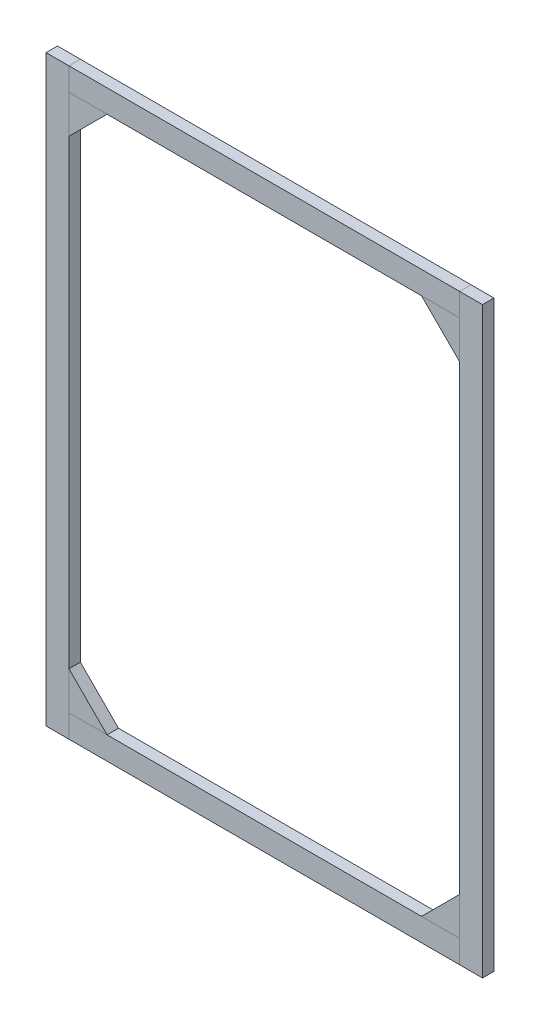
ISO-10303-21;
HEADER;
FILE_DESCRIPTION(('STEP AP214'),'2;1');
FILE_NAME('part.step','',(''),(''),'','','');
FILE_SCHEMA(('AUTOMOTIVE_DESIGN { 1 0 10303 214 1 1 1 1 }'));
ENDSEC;
DATA;
#1=APPLICATION_CONTEXT('core data for automotive mechanical design processes');
#2=APPLICATION_PROTOCOL_DEFINITION('international standard','automotive_design',2000,#1);
#3=PRODUCT_CONTEXT('',#1,'mechanical');
#4=PRODUCT('Part','Part','',(#3));
#5=PRODUCT_RELATED_PRODUCT_CATEGORY('part','',(#4));
#6=PRODUCT_DEFINITION_FORMATION('','',#4);
#7=PRODUCT_DEFINITION_CONTEXT('part definition',#1,'design');
#8=PRODUCT_DEFINITION('design','',#6,#7);
#9=PRODUCT_DEFINITION_SHAPE('','',#8);
#10=(LENGTH_UNIT() NAMED_UNIT(*) SI_UNIT(.MILLI.,.METRE.));
#11=(NAMED_UNIT(*) PLANE_ANGLE_UNIT() SI_UNIT($,.RADIAN.));
#12=(NAMED_UNIT(*) SI_UNIT($,.STERADIAN.) SOLID_ANGLE_UNIT());
#13=UNCERTAINTY_MEASURE_WITH_UNIT(LENGTH_MEASURE(1.E-05),#10,'distance_accuracy_value','');
#14=(GEOMETRIC_REPRESENTATION_CONTEXT(3) GLOBAL_UNCERTAINTY_ASSIGNED_CONTEXT((#13)) GLOBAL_UNIT_ASSIGNED_CONTEXT((#10,
#11,#12)) REPRESENTATION_CONTEXT('',''));
#15=CARTESIAN_POINT('',(0.,0.,0.));
#16=DIRECTION('',(0.,0.,1.));
#17=DIRECTION('',(1.,0.,0.));
#18=AXIS2_PLACEMENT_3D('',#15,#16,#17);
#19=CARTESIAN_POINT('',(412.5,-705.,-15.));
#20=DIRECTION('',(0.707106781186547,-0.707106781186547,0.));
#21=DIRECTION('',(0.707106781186548,0.707106781186548,0.));
#22=AXIS2_PLACEMENT_3D('',#19,#20,#21);
#23=PLANE('',#22);
#24=DIRECTION('',(0.707106781186547,0.707106781186547,0.));
#25=VECTOR('',#24,1.);
#26=CARTESIAN_POINT('',(412.5,-705.,15.));
#27=LINE('',#26,#25);
#28=CARTESIAN_POINT('',(412.5,-705.,15.));
#29=VERTEX_POINT('',#28);
#30=CARTESIAN_POINT('',(512.5,-605.,14.9999999999981));
#31=VERTEX_POINT('',#30);
#32=EDGE_CURVE('E124',#29,#31,#27,.T.);
#33=ORIENTED_EDGE('',*,*,#32,.T.);
#34=DIRECTION('',(0.,0.,1.));
#35=VECTOR('',#34,1.);
#36=CARTESIAN_POINT('',(512.5,-605.,-15.0000000000019));
#37=LINE('',#36,#35);
#38=CARTESIAN_POINT('',(512.5,-605.,-15.0000000000019));
#39=VERTEX_POINT('',#38);
#40=EDGE_CURVE('E13',#39,#31,#37,.T.);
#41=ORIENTED_EDGE('',*,*,#40,.F.);
#42=DIRECTION('',(0.707106781186547,0.707106781186547,0.));
#43=VECTOR('',#42,1.);
#44=CARTESIAN_POINT('',(412.5,-705.,-15.));
#45=LINE('',#44,#43);
#46=CARTESIAN_POINT('',(412.5,-705.,-15.));
#47=VERTEX_POINT('',#46);
#48=EDGE_CURVE('E117',#47,#39,#45,.T.);
#49=ORIENTED_EDGE('',*,*,#48,.F.);
#50=DIRECTION('',(0.,0.,1.));
#51=VECTOR('',#50,1.);
#52=CARTESIAN_POINT('',(412.5,-705.,-15.));
#53=LINE('',#52,#51);
#54=EDGE_CURVE('E125',#47,#29,#53,.T.);
#55=ORIENTED_EDGE('',*,*,#54,.T.);
#56=EDGE_LOOP('',(#33,#41,#49,#55));
#57=FACE_BOUND('',#56,.T.);
#58=ADVANCED_FACE('F74',(#57),#23,.F.);
#59=CARTESIAN_POINT('',(512.5,-705.,-15.));
#60=DIRECTION('',(-1.,0.,0.));
#61=DIRECTION('',(0.,0.,-1.));
#62=AXIS2_PLACEMENT_3D('',#59,#60,#61);
#63=PLANE('',#62);
#64=DIRECTION('',(0.,-1.,0.));
#65=VECTOR('',#64,1.);
#66=CARTESIAN_POINT('',(512.5,-705.,15.));
#67=LINE('',#66,#65);
#68=CARTESIAN_POINT('',(512.5,-705.,15.));
#69=VERTEX_POINT('',#68);
#70=EDGE_CURVE('E127',#31,#69,#67,.T.);
#71=ORIENTED_EDGE('',*,*,#70,.T.);
#72=DIRECTION('',(0.,0.,1.));
#73=VECTOR('',#72,1.);
#74=CARTESIAN_POINT('',(512.5,-705.,-15.));
#75=LINE('',#74,#73);
#76=CARTESIAN_POINT('',(512.5,-705.,-15.));
#77=VERTEX_POINT('',#76);
#78=EDGE_CURVE('E83',#77,#69,#75,.T.);
#79=ORIENTED_EDGE('',*,*,#78,.F.);
#80=DIRECTION('',(0.,-1.,0.));
#81=VECTOR('',#80,1.);
#82=CARTESIAN_POINT('',(512.5,-705.,-15.));
#83=LINE('',#82,#81);
#84=EDGE_CURVE('E111',#39,#77,#83,.T.);
#85=ORIENTED_EDGE('',*,*,#84,.F.);
#86=ORIENTED_EDGE('',*,*,#40,.T.);
#87=EDGE_LOOP('',(#71,#79,#85,#86));
#88=FACE_BOUND('',#87,.T.);
#89=ADVANCED_FACE('F113',(#88),#63,.F.);
#90=CARTESIAN_POINT('',(512.5,-705.,-15.));
#91=DIRECTION('',(0.,1.,0.));
#92=DIRECTION('',(0.,0.,-1.));
#93=AXIS2_PLACEMENT_3D('',#90,#91,#92);
#94=PLANE('',#93);
#95=DIRECTION('',(-1.,0.,0.));
#96=VECTOR('',#95,1.);
#97=CARTESIAN_POINT('',(512.5,-705.,15.));
#98=LINE('',#97,#96);
#99=EDGE_CURVE('E104',#69,#29,#98,.T.);
#100=ORIENTED_EDGE('',*,*,#99,.T.);
#101=ORIENTED_EDGE('',*,*,#54,.F.);
#102=DIRECTION('',(-1.,0.,0.));
#103=VECTOR('',#102,1.);
#104=CARTESIAN_POINT('',(512.5,-705.,-15.));
#105=LINE('',#104,#103);
#106=EDGE_CURVE('E91',#77,#47,#105,.T.);
#107=ORIENTED_EDGE('',*,*,#106,.F.);
#108=ORIENTED_EDGE('',*,*,#78,.T.);
#109=EDGE_LOOP('',(#100,#101,#107,#108));
#110=FACE_BOUND('',#109,.T.);
#111=ADVANCED_FACE('F139',(#110),#94,.F.);
#112=CARTESIAN_POINT('',(0.,-2.77469019982732E-13,-15.000000000013));
#113=DIRECTION('',(0.,0.,1.));
#114=DIRECTION('',(0.,1.,0.));
#115=AXIS2_PLACEMENT_3D('',#112,#113,#114);
#116=PLANE('',#115);
#117=ORIENTED_EDGE('',*,*,#48,.T.);
#118=ORIENTED_EDGE('',*,*,#84,.T.);
#119=ORIENTED_EDGE('',*,*,#106,.T.);
#120=EDGE_LOOP('',(#117,#118,#119));
#121=FACE_BOUND('',#120,.T.);
#122=ADVANCED_FACE('F120',(#121),#116,.F.);
#123=CARTESIAN_POINT('',(0.,2.77642492329846E-13,14.999999999987));
#124=DIRECTION('',(0.,0.,1.));
#125=DIRECTION('',(0.,1.,0.));
#126=AXIS2_PLACEMENT_3D('',#123,#124,#125);
#127=PLANE('',#126);
#128=ORIENTED_EDGE('',*,*,#32,.F.);
#129=ORIENTED_EDGE('',*,*,#99,.F.);
#130=ORIENTED_EDGE('',*,*,#70,.F.);
#131=EDGE_LOOP('',(#128,#129,#130));
#132=FACE_BOUND('',#131,.T.);
#133=ADVANCED_FACE('F140',(#132),#127,.T.);
#134=CLOSED_SHELL('',(#58,#89,#111,#122,#133));
#135=MANIFOLD_SOLID_BREP('B2',#134);
#136=CARTESIAN_POINT('',(-412.5,-705.,-15.));
#137=DIRECTION('',(-0.707106781186547,-0.707106781186547,0.));
#138=DIRECTION('',(-0.707106781186548,0.707106781186548,0.));
#139=AXIS2_PLACEMENT_3D('',#136,#137,#138);
#140=PLANE('',#139);
#141=DIRECTION('',(-0.707106781186547,0.707106781186547,0.));
#142=VECTOR('',#141,1.);
#143=CARTESIAN_POINT('',(-412.5,-705.,15.));
#144=LINE('',#143,#142);
#145=CARTESIAN_POINT('',(-412.5,-705.,15.));
#146=VERTEX_POINT('',#145);
#147=CARTESIAN_POINT('',(-512.5,-605.,14.9999999999981));
#148=VERTEX_POINT('',#147);
#149=EDGE_CURVE('E267',#146,#148,#144,.T.);
#150=ORIENTED_EDGE('',*,*,#149,.F.);
#151=DIRECTION('',(0.,0.,1.));
#152=VECTOR('',#151,1.);
#153=CARTESIAN_POINT('',(-412.5,-705.,-15.));
#154=LINE('',#153,#152);
#155=CARTESIAN_POINT('',(-412.5,-705.,-15.));
#156=VERTEX_POINT('',#155);
#157=EDGE_CURVE('E258',#156,#146,#154,.T.);
#158=ORIENTED_EDGE('',*,*,#157,.F.);
#159=DIRECTION('',(-0.707106781186547,0.707106781186547,0.));
#160=VECTOR('',#159,1.);
#161=CARTESIAN_POINT('',(-412.5,-705.,-15.));
#162=LINE('',#161,#160);
#163=CARTESIAN_POINT('',(-512.5,-605.,-15.0000000000019));
#164=VERTEX_POINT('',#163);
#165=EDGE_CURVE('E249',#156,#164,#162,.T.);
#166=ORIENTED_EDGE('',*,*,#165,.T.);
#167=DIRECTION('',(0.,0.,1.));
#168=VECTOR('',#167,1.);
#169=CARTESIAN_POINT('',(-512.5,-605.,-15.0000000000019));
#170=LINE('',#169,#168);
#171=EDGE_CURVE('E72',#164,#148,#170,.T.);
#172=ORIENTED_EDGE('',*,*,#171,.T.);
#173=EDGE_LOOP('',(#150,#158,#166,#172));
#174=FACE_BOUND('',#173,.T.);
#175=ADVANCED_FACE('F209',(#174),#140,.F.);
#176=CARTESIAN_POINT('',(-512.5,-705.,-15.));
#177=DIRECTION('',(1.,0.,0.));
#178=DIRECTION('',(0.,0.,-1.));
#179=AXIS2_PLACEMENT_3D('',#176,#177,#178);
#180=PLANE('',#179);
#181=DIRECTION('',(0.,-1.,0.));
#182=VECTOR('',#181,1.);
#183=CARTESIAN_POINT('',(-512.5,-705.,15.));
#184=LINE('',#183,#182);
#185=CARTESIAN_POINT('',(-512.5,-705.,15.));
#186=VERTEX_POINT('',#185);
#187=EDGE_CURVE('E255',#148,#186,#184,.T.);
#188=ORIENTED_EDGE('',*,*,#187,.F.);
#189=ORIENTED_EDGE('',*,*,#171,.F.);
#190=DIRECTION('',(0.,-1.,0.));
#191=VECTOR('',#190,1.);
#192=CARTESIAN_POINT('',(-512.5,-705.,-15.));
#193=LINE('',#192,#191);
#194=CARTESIAN_POINT('',(-512.5,-705.,-15.));
#195=VERTEX_POINT('',#194);
#196=EDGE_CURVE('E245',#164,#195,#193,.T.);
#197=ORIENTED_EDGE('',*,*,#196,.T.);
#198=DIRECTION('',(0.,0.,1.));
#199=VECTOR('',#198,1.);
#200=CARTESIAN_POINT('',(-512.5,-705.,-15.));
#201=LINE('',#200,#199);
#202=EDGE_CURVE('E218',#195,#186,#201,.T.);
#203=ORIENTED_EDGE('',*,*,#202,.T.);
#204=EDGE_LOOP('',(#188,#189,#197,#203));
#205=FACE_BOUND('',#204,.T.);
#206=ADVANCED_FACE('F254',(#205),#180,.F.);
#207=CARTESIAN_POINT('',(-512.5,-705.,-15.));
#208=DIRECTION('',(0.,1.,0.));
#209=DIRECTION('',(0.,0.,-1.));
#210=AXIS2_PLACEMENT_3D('',#207,#208,#209);
#211=PLANE('',#210);
#212=DIRECTION('',(1.,0.,0.));
#213=VECTOR('',#212,1.);
#214=CARTESIAN_POINT('',(-512.5,-705.,15.));
#215=LINE('',#214,#213);
#216=EDGE_CURVE('E237',#186,#146,#215,.T.);
#217=ORIENTED_EDGE('',*,*,#216,.F.);
#218=ORIENTED_EDGE('',*,*,#202,.F.);
#219=DIRECTION('',(1.,0.,0.));
#220=VECTOR('',#219,1.);
#221=CARTESIAN_POINT('',(-512.5,-705.,-15.));
#222=LINE('',#221,#220);
#223=EDGE_CURVE('E226',#195,#156,#222,.T.);
#224=ORIENTED_EDGE('',*,*,#223,.T.);
#225=ORIENTED_EDGE('',*,*,#157,.T.);
#226=EDGE_LOOP('',(#217,#218,#224,#225));
#227=FACE_BOUND('',#226,.T.);
#228=ADVANCED_FACE('F281',(#227),#211,.F.);
#229=CARTESIAN_POINT('',(0.,-2.77469019982732E-13,-15.000000000013));
#230=DIRECTION('',(0.,0.,1.));
#231=DIRECTION('',(0.,1.,0.));
#232=AXIS2_PLACEMENT_3D('',#229,#230,#231);
#233=PLANE('',#232);
#234=ORIENTED_EDGE('',*,*,#165,.F.);
#235=ORIENTED_EDGE('',*,*,#223,.F.);
#236=ORIENTED_EDGE('',*,*,#196,.F.);
#237=EDGE_LOOP('',(#234,#235,#236));
#238=FACE_BOUND('',#237,.T.);
#239=ADVANCED_FACE('F247',(#238),#233,.F.);
#240=CARTESIAN_POINT('',(0.,2.77642492329846E-13,14.999999999987));
#241=DIRECTION('',(0.,0.,1.));
#242=DIRECTION('',(0.,1.,0.));
#243=AXIS2_PLACEMENT_3D('',#240,#241,#242);
#244=PLANE('',#243);
#245=ORIENTED_EDGE('',*,*,#149,.T.);
#246=ORIENTED_EDGE('',*,*,#187,.T.);
#247=ORIENTED_EDGE('',*,*,#216,.T.);
#248=EDGE_LOOP('',(#245,#246,#247));
#249=FACE_BOUND('',#248,.T.);
#250=ADVANCED_FACE('F275',(#249),#244,.T.);
#251=CLOSED_SHELL('',(#175,#206,#228,#239,#250));
#252=MANIFOLD_SOLID_BREP('B7',#251);
#253=CARTESIAN_POINT('',(412.5,705.,-15.));
#254=DIRECTION('',(0.707106781186547,0.707106781186547,0.));
#255=DIRECTION('',(0.707106781186548,-0.707106781186548,0.));
#256=AXIS2_PLACEMENT_3D('',#253,#254,#255);
#257=PLANE('',#256);
#258=DIRECTION('',(0.707106781186547,-0.707106781186547,0.));
#259=VECTOR('',#258,1.);
#260=CARTESIAN_POINT('',(412.5,705.,15.));
#261=LINE('',#260,#259);
#262=CARTESIAN_POINT('',(412.5,705.,15.));
#263=VERTEX_POINT('',#262);
#264=CARTESIAN_POINT('',(512.5,605.,14.9999999999981));
#265=VERTEX_POINT('',#264);
#266=EDGE_CURVE('E402',#263,#265,#261,.T.);
#267=ORIENTED_EDGE('',*,*,#266,.F.);
#268=DIRECTION('',(0.,0.,1.));
#269=VECTOR('',#268,1.);
#270=CARTESIAN_POINT('',(412.5,705.,-15.));
#271=LINE('',#270,#269);
#272=CARTESIAN_POINT('',(412.5,705.,-15.));
#273=VERTEX_POINT('',#272);
#274=EDGE_CURVE('E393',#273,#263,#271,.T.);
#275=ORIENTED_EDGE('',*,*,#274,.F.);
#276=DIRECTION('',(0.707106781186547,-0.707106781186547,0.));
#277=VECTOR('',#276,1.);
#278=CARTESIAN_POINT('',(412.5,705.,-15.));
#279=LINE('',#278,#277);
#280=CARTESIAN_POINT('',(512.5,605.,-15.0000000000019));
#281=VERTEX_POINT('',#280);
#282=EDGE_CURVE('E384',#273,#281,#279,.T.);
#283=ORIENTED_EDGE('',*,*,#282,.T.);
#284=DIRECTION('',(0.,0.,1.));
#285=VECTOR('',#284,1.);
#286=CARTESIAN_POINT('',(512.5,605.,-15.0000000000019));
#287=LINE('',#286,#285);
#288=EDGE_CURVE('E207',#281,#265,#287,.T.);
#289=ORIENTED_EDGE('',*,*,#288,.T.);
#290=EDGE_LOOP('',(#267,#275,#283,#289));
#291=FACE_BOUND('',#290,.T.);
#292=ADVANCED_FACE('F344',(#291),#257,.F.);
#293=CARTESIAN_POINT('',(512.5,705.,-15.));
#294=DIRECTION('',(-1.,0.,0.));
#295=DIRECTION('',(0.,0.,-1.));
#296=AXIS2_PLACEMENT_3D('',#293,#294,#295);
#297=PLANE('',#296);
#298=DIRECTION('',(0.,1.,0.));
#299=VECTOR('',#298,1.);
#300=CARTESIAN_POINT('',(512.5,705.,15.));
#301=LINE('',#300,#299);
#302=CARTESIAN_POINT('',(512.5,705.,15.));
#303=VERTEX_POINT('',#302);
#304=EDGE_CURVE('E390',#265,#303,#301,.T.);
#305=ORIENTED_EDGE('',*,*,#304,.F.);
#306=ORIENTED_EDGE('',*,*,#288,.F.);
#307=DIRECTION('',(0.,1.,0.));
#308=VECTOR('',#307,1.);
#309=CARTESIAN_POINT('',(512.5,705.,-15.));
#310=LINE('',#309,#308);
#311=CARTESIAN_POINT('',(512.5,705.,-15.));
#312=VERTEX_POINT('',#311);
#313=EDGE_CURVE('E380',#281,#312,#310,.T.);
#314=ORIENTED_EDGE('',*,*,#313,.T.);
#315=DIRECTION('',(0.,0.,1.));
#316=VECTOR('',#315,1.);
#317=CARTESIAN_POINT('',(512.5,705.,-15.));
#318=LINE('',#317,#316);
#319=EDGE_CURVE('E353',#312,#303,#318,.T.);
#320=ORIENTED_EDGE('',*,*,#319,.T.);
#321=EDGE_LOOP('',(#305,#306,#314,#320));
#322=FACE_BOUND('',#321,.T.);
#323=ADVANCED_FACE('F389',(#322),#297,.F.);
#324=CARTESIAN_POINT('',(512.5,705.,-15.));
#325=DIRECTION('',(0.,-1.,0.));
#326=DIRECTION('',(0.,0.,-1.));
#327=AXIS2_PLACEMENT_3D('',#324,#325,#326);
#328=PLANE('',#327);
#329=DIRECTION('',(-1.,0.,0.));
#330=VECTOR('',#329,1.);
#331=CARTESIAN_POINT('',(512.5,705.,15.));
#332=LINE('',#331,#330);
#333=EDGE_CURVE('E372',#303,#263,#332,.T.);
#334=ORIENTED_EDGE('',*,*,#333,.F.);
#335=ORIENTED_EDGE('',*,*,#319,.F.);
#336=DIRECTION('',(-1.,0.,0.));
#337=VECTOR('',#336,1.);
#338=CARTESIAN_POINT('',(512.5,705.,-15.));
#339=LINE('',#338,#337);
#340=EDGE_CURVE('E361',#312,#273,#339,.T.);
#341=ORIENTED_EDGE('',*,*,#340,.T.);
#342=ORIENTED_EDGE('',*,*,#274,.T.);
#343=EDGE_LOOP('',(#334,#335,#341,#342));
#344=FACE_BOUND('',#343,.T.);
#345=ADVANCED_FACE('F416',(#344),#328,.F.);
#346=CARTESIAN_POINT('',(0.,2.77469019982732E-13,-15.000000000013));
#347=DIRECTION('',(0.,0.,1.));
#348=DIRECTION('',(0.,-1.,0.));
#349=AXIS2_PLACEMENT_3D('',#346,#347,#348);
#350=PLANE('',#349);
#351=ORIENTED_EDGE('',*,*,#282,.F.);
#352=ORIENTED_EDGE('',*,*,#340,.F.);
#353=ORIENTED_EDGE('',*,*,#313,.F.);
#354=EDGE_LOOP('',(#351,#352,#353));
#355=FACE_BOUND('',#354,.T.);
#356=ADVANCED_FACE('F382',(#355),#350,.F.);
#357=CARTESIAN_POINT('',(0.,-2.77642492329846E-13,14.999999999987));
#358=DIRECTION('',(0.,0.,1.));
#359=DIRECTION('',(0.,-1.,0.));
#360=AXIS2_PLACEMENT_3D('',#357,#358,#359);
#361=PLANE('',#360);
#362=ORIENTED_EDGE('',*,*,#266,.T.);
#363=ORIENTED_EDGE('',*,*,#304,.T.);
#364=ORIENTED_EDGE('',*,*,#333,.T.);
#365=EDGE_LOOP('',(#362,#363,#364));
#366=FACE_BOUND('',#365,.T.);
#367=ADVANCED_FACE('F410',(#366),#361,.T.);
#368=CLOSED_SHELL('',(#292,#323,#345,#356,#367));
#369=MANIFOLD_SOLID_BREP('B66',#368);
#370=CARTESIAN_POINT('',(-412.5,705.,-15.));
#371=DIRECTION('',(-0.707106781186547,0.707106781186547,0.));
#372=DIRECTION('',(-0.707106781186548,-0.707106781186548,0.));
#373=AXIS2_PLACEMENT_3D('',#370,#371,#372);
#374=PLANE('',#373);
#375=DIRECTION('',(-0.707106781186547,-0.707106781186547,0.));
#376=VECTOR('',#375,1.);
#377=CARTESIAN_POINT('',(-412.5,705.,15.));
#378=LINE('',#377,#376);
#379=CARTESIAN_POINT('',(-412.5,705.,15.));
#380=VERTEX_POINT('',#379);
#381=CARTESIAN_POINT('',(-512.5,605.,14.9999999999981));
#382=VERTEX_POINT('',#381);
#383=EDGE_CURVE('E529',#380,#382,#378,.T.);
#384=ORIENTED_EDGE('',*,*,#383,.T.);
#385=DIRECTION('',(0.,0.,1.));
#386=VECTOR('',#385,1.);
#387=CARTESIAN_POINT('',(-512.5,605.,-15.0000000000019));
#388=LINE('',#387,#386);
#389=CARTESIAN_POINT('',(-512.5,605.,-15.0000000000019));
#390=VERTEX_POINT('',#389);
#391=EDGE_CURVE('E342',#390,#382,#388,.T.);
#392=ORIENTED_EDGE('',*,*,#391,.F.);
#393=DIRECTION('',(-0.707106781186547,-0.707106781186547,0.));
#394=VECTOR('',#393,1.);
#395=CARTESIAN_POINT('',(-412.5,705.,-15.));
#396=LINE('',#395,#394);
#397=CARTESIAN_POINT('',(-412.5,705.,-15.));
#398=VERTEX_POINT('',#397);
#399=EDGE_CURVE('E521',#398,#390,#396,.T.);
#400=ORIENTED_EDGE('',*,*,#399,.F.);
#401=DIRECTION('',(0.,0.,1.));
#402=VECTOR('',#401,1.);
#403=CARTESIAN_POINT('',(-412.5,705.,-15.));
#404=LINE('',#403,#402);
#405=EDGE_CURVE('E530',#398,#380,#404,.T.);
#406=ORIENTED_EDGE('',*,*,#405,.T.);
#407=EDGE_LOOP('',(#384,#392,#400,#406));
#408=FACE_BOUND('',#407,.T.);
#409=ADVANCED_FACE('F479',(#408),#374,.F.);
#410=CARTESIAN_POINT('',(-512.5,705.,-15.));
#411=DIRECTION('',(1.,0.,0.));
#412=DIRECTION('',(0.,0.,-1.));
#413=AXIS2_PLACEMENT_3D('',#410,#411,#412);
#414=PLANE('',#413);
#415=DIRECTION('',(0.,1.,0.));
#416=VECTOR('',#415,1.);
#417=CARTESIAN_POINT('',(-512.5,705.,15.));
#418=LINE('',#417,#416);
#419=CARTESIAN_POINT('',(-512.5,705.,15.));
#420=VERTEX_POINT('',#419);
#421=EDGE_CURVE('E508',#382,#420,#418,.T.);
#422=ORIENTED_EDGE('',*,*,#421,.T.);
#423=DIRECTION('',(0.,0.,1.));
#424=VECTOR('',#423,1.);
#425=CARTESIAN_POINT('',(-512.5,705.,-15.));
#426=LINE('',#425,#424);
#427=CARTESIAN_POINT('',(-512.5,705.,-15.));
#428=VERTEX_POINT('',#427);
#429=EDGE_CURVE('E488',#428,#420,#426,.T.);
#430=ORIENTED_EDGE('',*,*,#429,.F.);
#431=DIRECTION('',(0.,1.,0.));
#432=VECTOR('',#431,1.);
#433=CARTESIAN_POINT('',(-512.5,705.,-15.));
#434=LINE('',#433,#432);
#435=EDGE_CURVE('E516',#390,#428,#434,.T.);
#436=ORIENTED_EDGE('',*,*,#435,.F.);
#437=ORIENTED_EDGE('',*,*,#391,.T.);
#438=EDGE_LOOP('',(#422,#430,#436,#437));
#439=FACE_BOUND('',#438,.T.);
#440=ADVANCED_FACE('F517',(#439),#414,.F.);
#441=CARTESIAN_POINT('',(-512.5,705.,-15.));
#442=DIRECTION('',(0.,-1.,0.));
#443=DIRECTION('',(0.,0.,-1.));
#444=AXIS2_PLACEMENT_3D('',#441,#442,#443);
#445=PLANE('',#444);
#446=DIRECTION('',(1.,0.,0.));
#447=VECTOR('',#446,1.);
#448=CARTESIAN_POINT('',(-512.5,705.,15.));
#449=LINE('',#448,#447);
#450=EDGE_CURVE('E513',#420,#380,#449,.T.);
#451=ORIENTED_EDGE('',*,*,#450,.T.);
#452=ORIENTED_EDGE('',*,*,#405,.F.);
#453=DIRECTION('',(1.,0.,0.));
#454=VECTOR('',#453,1.);
#455=CARTESIAN_POINT('',(-512.5,705.,-15.));
#456=LINE('',#455,#454);
#457=EDGE_CURVE('E496',#428,#398,#456,.T.);
#458=ORIENTED_EDGE('',*,*,#457,.F.);
#459=ORIENTED_EDGE('',*,*,#429,.T.);
#460=EDGE_LOOP('',(#451,#452,#458,#459));
#461=FACE_BOUND('',#460,.T.);
#462=ADVANCED_FACE('F544',(#461),#445,.F.);
#463=CARTESIAN_POINT('',(0.,2.77469019982732E-13,-15.000000000013));
#464=DIRECTION('',(0.,0.,1.));
#465=DIRECTION('',(0.,-1.,0.));
#466=AXIS2_PLACEMENT_3D('',#463,#464,#465);
#467=PLANE('',#466);
#468=ORIENTED_EDGE('',*,*,#399,.T.);
#469=ORIENTED_EDGE('',*,*,#435,.T.);
#470=ORIENTED_EDGE('',*,*,#457,.T.);
#471=EDGE_LOOP('',(#468,#469,#470));
#472=FACE_BOUND('',#471,.T.);
#473=ADVANCED_FACE('F524',(#472),#467,.F.);
#474=CARTESIAN_POINT('',(0.,-2.77642492329846E-13,14.999999999987));
#475=DIRECTION('',(0.,0.,1.));
#476=DIRECTION('',(0.,-1.,0.));
#477=AXIS2_PLACEMENT_3D('',#474,#475,#476);
#478=PLANE('',#477);
#479=ORIENTED_EDGE('',*,*,#383,.F.);
#480=ORIENTED_EDGE('',*,*,#450,.F.);
#481=ORIENTED_EDGE('',*,*,#421,.F.);
#482=EDGE_LOOP('',(#479,#480,#481));
#483=FACE_BOUND('',#482,.T.);
#484=ADVANCED_FACE('F545',(#483),#478,.T.);
#485=CLOSED_SHELL('',(#409,#440,#462,#473,#484));
#486=MANIFOLD_SOLID_BREP('B201',#485);
#487=CARTESIAN_POINT('',(512.5,-735.,-15.));
#488=DIRECTION('',(1.,0.,0.));
#489=DIRECTION('',(0.,0.,-1.));
#490=AXIS2_PLACEMENT_3D('',#487,#488,#489);
#491=PLANE('',#490);
#492=DIRECTION('',(0.,0.,1.));
#493=VECTOR('',#492,1.);
#494=CARTESIAN_POINT('',(512.5,765.,15.));
#495=LINE('',#494,#493);
#496=CARTESIAN_POINT('',(512.5,765.000000000001,-15.));
#497=VERTEX_POINT('',#496);
#498=CARTESIAN_POINT('',(512.5,765.000000000001,15.));
#499=VERTEX_POINT('',#498);
#500=EDGE_CURVE('E670',#497,#499,#495,.T.);
#501=ORIENTED_EDGE('',*,*,#500,.T.);
#502=DIRECTION('',(0.,1.,0.));
#503=VECTOR('',#502,1.);
#504=CARTESIAN_POINT('',(512.5,-735.,15.));
#505=LINE('',#504,#503);
#506=CARTESIAN_POINT('',(512.5,705.,15.));
#507=VERTEX_POINT('',#506);
#508=EDGE_CURVE('E694',#507,#499,#505,.T.);
#509=ORIENTED_EDGE('',*,*,#508,.F.);
#510=DIRECTION('',(0.,0.,-1.));
#511=VECTOR('',#510,1.);
#512=CARTESIAN_POINT('',(512.5,705.,-15.));
#513=LINE('',#512,#511);
#514=CARTESIAN_POINT('',(512.5,705.,-15.));
#515=VERTEX_POINT('',#514);
#516=EDGE_CURVE('E637',#507,#515,#513,.T.);
#517=ORIENTED_EDGE('',*,*,#516,.T.);
#518=DIRECTION('',(0.,1.,0.));
#519=VECTOR('',#518,1.);
#520=CARTESIAN_POINT('',(512.5,705.,-15.));
#521=LINE('',#520,#519);
#522=EDGE_CURVE('E623',#515,#497,#521,.T.);
#523=ORIENTED_EDGE('',*,*,#522,.T.);
#524=EDGE_LOOP('',(#501,#509,#517,#523));
#525=FACE_BOUND('',#524,.T.);
#526=ADVANCED_FACE('F614',(#525),#491,.T.);
#527=CARTESIAN_POINT('',(542.5,765.,15.));
#528=DIRECTION('',(0.,-1.,0.));
#529=DIRECTION('',(1.,0.,0.));
#530=AXIS2_PLACEMENT_3D('',#527,#528,#529);
#531=PLANE('',#530);
#532=DIRECTION('',(0.,0.,-1.));
#533=VECTOR('',#532,1.);
#534=CARTESIAN_POINT('',(-512.5,765.,15.));
#535=LINE('',#534,#533);
#536=CARTESIAN_POINT('',(-512.5,765.,15.));
#537=VERTEX_POINT('',#536);
#538=CARTESIAN_POINT('',(-512.5,765.,-15.));
#539=VERTEX_POINT('',#538);
#540=EDGE_CURVE('E477',#537,#539,#535,.T.);
#541=ORIENTED_EDGE('',*,*,#540,.F.);
#542=DIRECTION('',(-1.,0.,0.));
#543=VECTOR('',#542,1.);
#544=CARTESIAN_POINT('',(542.5,765.,15.));
#545=LINE('',#544,#543);
#546=EDGE_CURVE('E684',#499,#537,#545,.T.);
#547=ORIENTED_EDGE('',*,*,#546,.F.);
#548=ORIENTED_EDGE('',*,*,#500,.F.);
#549=DIRECTION('',(-1.,0.,0.));
#550=VECTOR('',#549,1.);
#551=CARTESIAN_POINT('',(542.5,765.,-15.));
#552=LINE('',#551,#550);
#553=EDGE_CURVE('E664',#497,#539,#552,.T.);
#554=ORIENTED_EDGE('',*,*,#553,.T.);
#555=EDGE_LOOP('',(#541,#547,#548,#554));
#556=FACE_BOUND('',#555,.T.);
#557=ADVANCED_FACE('F616',(#556),#531,.F.);
#558=CARTESIAN_POINT('',(542.5,765.,15.));
#559=DIRECTION('',(0.,0.,-1.));
#560=DIRECTION('',(-1.,0.,0.));
#561=AXIS2_PLACEMENT_3D('',#558,#559,#560);
#562=PLANE('',#561);
#563=DIRECTION('',(0.,-1.,0.));
#564=VECTOR('',#563,1.);
#565=CARTESIAN_POINT('',(-512.5,735.,15.));
#566=LINE('',#565,#564);
#567=CARTESIAN_POINT('',(-512.5,704.999999999999,15.));
#568=VERTEX_POINT('',#567);
#569=EDGE_CURVE('E629',#537,#568,#566,.T.);
#570=ORIENTED_EDGE('',*,*,#569,.T.);
#571=DIRECTION('',(-1.,0.,0.));
#572=VECTOR('',#571,1.);
#573=CARTESIAN_POINT('',(542.5,705.,15.));
#574=LINE('',#573,#572);
#575=EDGE_CURVE('E676',#507,#568,#574,.T.);
#576=ORIENTED_EDGE('',*,*,#575,.F.);
#577=ORIENTED_EDGE('',*,*,#508,.T.);
#578=ORIENTED_EDGE('',*,*,#546,.T.);
#579=EDGE_LOOP('',(#570,#576,#577,#578));
#580=FACE_BOUND('',#579,.T.);
#581=ADVANCED_FACE('F707',(#580),#562,.F.);
#582=CARTESIAN_POINT('',(542.5,705.,-15.));
#583=DIRECTION('',(0.,1.,0.));
#584=DIRECTION('',(-1.,0.,0.));
#585=AXIS2_PLACEMENT_3D('',#582,#583,#584);
#586=PLANE('',#585);
#587=DIRECTION('',(0.,0.,1.));
#588=VECTOR('',#587,1.);
#589=CARTESIAN_POINT('',(-512.5,705.,-15.));
#590=LINE('',#589,#588);
#591=CARTESIAN_POINT('',(-512.5,705.,-15.));
#592=VERTEX_POINT('',#591);
#593=EDGE_CURVE('E692',#592,#568,#590,.T.);
#594=ORIENTED_EDGE('',*,*,#593,.F.);
#595=DIRECTION('',(-1.,0.,0.));
#596=VECTOR('',#595,1.);
#597=CARTESIAN_POINT('',(542.5,705.,-15.));
#598=LINE('',#597,#596);
#599=EDGE_CURVE('E666',#515,#592,#598,.T.);
#600=ORIENTED_EDGE('',*,*,#599,.F.);
#601=ORIENTED_EDGE('',*,*,#516,.F.);
#602=ORIENTED_EDGE('',*,*,#575,.T.);
#603=EDGE_LOOP('',(#594,#600,#601,#602));
#604=FACE_BOUND('',#603,.T.);
#605=ADVANCED_FACE('F690',(#604),#586,.F.);
#606=CARTESIAN_POINT('',(542.5,705.,-15.));
#607=DIRECTION('',(0.,0.,1.));
#608=DIRECTION('',(0.,-1.,0.));
#609=AXIS2_PLACEMENT_3D('',#606,#607,#608);
#610=PLANE('',#609);
#611=DIRECTION('',(0.,-1.,0.));
#612=VECTOR('',#611,1.);
#613=CARTESIAN_POINT('',(-512.5,735.,-15.));
#614=LINE('',#613,#612);
#615=EDGE_CURVE('E654',#539,#592,#614,.T.);
#616=ORIENTED_EDGE('',*,*,#615,.F.);
#617=ORIENTED_EDGE('',*,*,#553,.F.);
#618=ORIENTED_EDGE('',*,*,#522,.F.);
#619=ORIENTED_EDGE('',*,*,#599,.T.);
#620=EDGE_LOOP('',(#616,#617,#618,#619));
#621=FACE_BOUND('',#620,.T.);
#622=ADVANCED_FACE('F663',(#621),#610,.F.);
#623=CARTESIAN_POINT('',(-512.5,735.,-15.));
#624=DIRECTION('',(-1.,0.,0.));
#625=DIRECTION('',(0.,-1.,0.));
#626=AXIS2_PLACEMENT_3D('',#623,#624,#625);
#627=PLANE('',#626);
#628=ORIENTED_EDGE('',*,*,#593,.T.);
#629=ORIENTED_EDGE('',*,*,#569,.F.);
#630=ORIENTED_EDGE('',*,*,#540,.T.);
#631=ORIENTED_EDGE('',*,*,#615,.T.);
#632=EDGE_LOOP('',(#628,#629,#630,#631));
#633=FACE_BOUND('',#632,.T.);
#634=ADVANCED_FACE('F653',(#633),#627,.T.);
#635=CLOSED_SHELL('',(#526,#557,#581,#605,#622,#634));
#636=MANIFOLD_SOLID_BREP('B336',#635);
#637=CARTESIAN_POINT('',(-572.5,735.,15.));
#638=DIRECTION('',(1.,0.,0.));
#639=DIRECTION('',(0.,1.,0.));
#640=AXIS2_PLACEMENT_3D('',#637,#638,#639);
#641=PLANE('',#640);
#642=DIRECTION('',(0.,0.,1.));
#643=VECTOR('',#642,1.);
#644=CARTESIAN_POINT('',(-572.5,765.,15.));
#645=LINE('',#644,#643);
#646=CARTESIAN_POINT('',(-572.500000000003,765.,-15.));
#647=VERTEX_POINT('',#646);
#648=CARTESIAN_POINT('',(-572.5,765.,15.));
#649=VERTEX_POINT('',#648);
#650=EDGE_CURVE('E863',#647,#649,#645,.T.);
#651=ORIENTED_EDGE('',*,*,#650,.F.);
#652=DIRECTION('',(0.,-1.,0.));
#653=VECTOR('',#652,1.);
#654=CARTESIAN_POINT('',(-572.5,735.,-15.));
#655=LINE('',#654,#653);
#656=CARTESIAN_POINT('',(-572.5,-765.,-15.));
#657=VERTEX_POINT('',#656);
#658=EDGE_CURVE('E816',#647,#657,#655,.T.);
#659=ORIENTED_EDGE('',*,*,#658,.T.);
#660=DIRECTION('',(0.,0.,-1.));
#661=VECTOR('',#660,1.);
#662=CARTESIAN_POINT('',(-572.5,-765.,15.));
#663=LINE('',#662,#661);
#664=CARTESIAN_POINT('',(-572.5,-765.,15.));
#665=VERTEX_POINT('',#664);
#666=EDGE_CURVE('E867',#665,#657,#663,.T.);
#667=ORIENTED_EDGE('',*,*,#666,.F.);
#668=DIRECTION('',(0.,-1.,0.));
#669=VECTOR('',#668,1.);
#670=CARTESIAN_POINT('',(-572.5,735.,15.));
#671=LINE('',#670,#669);
#672=EDGE_CURVE('E858',#649,#665,#671,.T.);
#673=ORIENTED_EDGE('',*,*,#672,.F.);
#674=EDGE_LOOP('',(#651,#659,#667,#673));
#675=FACE_BOUND('',#674,.T.);
#676=ADVANCED_FACE('F812',(#675),#641,.F.);
#677=CARTESIAN_POINT('',(-572.5,735.,15.));
#678=DIRECTION('',(0.,0.,-1.));
#679=DIRECTION('',(-1.,0.,0.));
#680=AXIS2_PLACEMENT_3D('',#677,#678,#679);
#681=PLANE('',#680);
#682=DIRECTION('',(1.,0.,0.));
#683=VECTOR('',#682,1.);
#684=CARTESIAN_POINT('',(-572.5,765.,15.));
#685=LINE('',#684,#683);
#686=CARTESIAN_POINT('',(-512.5,765.,15.));
#687=VERTEX_POINT('',#686);
#688=EDGE_CURVE('E822',#649,#687,#685,.T.);
#689=ORIENTED_EDGE('',*,*,#688,.F.);
#690=ORIENTED_EDGE('',*,*,#672,.T.);
#691=DIRECTION('',(-1.,0.,0.));
#692=VECTOR('',#691,1.);
#693=CARTESIAN_POINT('',(-572.5,-765.,15.));
#694=LINE('',#693,#692);
#695=CARTESIAN_POINT('',(-512.5,-765.,15.));
#696=VERTEX_POINT('',#695);
#697=EDGE_CURVE('E880',#696,#665,#694,.T.);
#698=ORIENTED_EDGE('',*,*,#697,.F.);
#699=DIRECTION('',(0.,-1.,0.));
#700=VECTOR('',#699,1.);
#701=CARTESIAN_POINT('',(-512.5,735.,15.));
#702=LINE('',#701,#700);
#703=EDGE_CURVE('E859',#687,#696,#702,.T.);
#704=ORIENTED_EDGE('',*,*,#703,.F.);
#705=EDGE_LOOP('',(#689,#690,#698,#704));
#706=FACE_BOUND('',#705,.T.);
#707=ADVANCED_FACE('F856',(#706),#681,.F.);
#708=CARTESIAN_POINT('',(-512.5,735.,-15.));
#709=DIRECTION('',(-1.,0.,0.));
#710=DIRECTION('',(0.,-1.,0.));
#711=AXIS2_PLACEMENT_3D('',#708,#709,#710);
#712=PLANE('',#711);
#713=DIRECTION('',(0.,0.,-1.));
#714=VECTOR('',#713,1.);
#715=CARTESIAN_POINT('',(-512.5,765.,-15.));
#716=LINE('',#715,#714);
#717=CARTESIAN_POINT('',(-512.5,765.,-15.));
#718=VERTEX_POINT('',#717);
#719=EDGE_CURVE('E612',#687,#718,#716,.T.);
#720=ORIENTED_EDGE('',*,*,#719,.F.);
#721=ORIENTED_EDGE('',*,*,#703,.T.);
#722=DIRECTION('',(0.,0.,1.));
#723=VECTOR('',#722,1.);
#724=CARTESIAN_POINT('',(-512.5,-765.,-15.));
#725=LINE('',#724,#723);
#726=CARTESIAN_POINT('',(-512.499999999998,-765.,-15.));
#727=VERTEX_POINT('',#726);
#728=EDGE_CURVE('E875',#727,#696,#725,.T.);
#729=ORIENTED_EDGE('',*,*,#728,.F.);
#730=DIRECTION('',(0.,-1.,0.));
#731=VECTOR('',#730,1.);
#732=CARTESIAN_POINT('',(-512.5,735.,-15.));
#733=LINE('',#732,#731);
#734=EDGE_CURVE('E835',#718,#727,#733,.T.);
#735=ORIENTED_EDGE('',*,*,#734,.F.);
#736=EDGE_LOOP('',(#720,#721,#729,#735));
#737=FACE_BOUND('',#736,.T.);
#738=ADVANCED_FACE('F885',(#737),#712,.F.);
#739=CARTESIAN_POINT('',(-512.5,735.,-15.));
#740=DIRECTION('',(0.,0.,1.));
#741=DIRECTION('',(1.,0.,0.));
#742=AXIS2_PLACEMENT_3D('',#739,#740,#741);
#743=PLANE('',#742);
#744=DIRECTION('',(-1.,0.,0.));
#745=VECTOR('',#744,1.);
#746=CARTESIAN_POINT('',(-512.5,765.,-15.));
#747=LINE('',#746,#745);
#748=EDGE_CURVE('E870',#718,#647,#747,.T.);
#749=ORIENTED_EDGE('',*,*,#748,.F.);
#750=ORIENTED_EDGE('',*,*,#734,.T.);
#751=DIRECTION('',(1.,0.,0.));
#752=VECTOR('',#751,1.);
#753=CARTESIAN_POINT('',(-512.5,-765.,-15.));
#754=LINE('',#753,#752);
#755=EDGE_CURVE('E892',#657,#727,#754,.T.);
#756=ORIENTED_EDGE('',*,*,#755,.F.);
#757=ORIENTED_EDGE('',*,*,#658,.F.);
#758=EDGE_LOOP('',(#749,#750,#756,#757));
#759=FACE_BOUND('',#758,.T.);
#760=ADVANCED_FACE('F905',(#759),#743,.F.);
#761=CARTESIAN_POINT('',(-542.5,-765.,15.));
#762=DIRECTION('',(0.,-1.,0.));
#763=DIRECTION('',(1.,0.,0.));
#764=AXIS2_PLACEMENT_3D('',#761,#762,#763);
#765=PLANE('',#764);
#766=ORIENTED_EDGE('',*,*,#697,.T.);
#767=ORIENTED_EDGE('',*,*,#666,.T.);
#768=ORIENTED_EDGE('',*,*,#755,.T.);
#769=ORIENTED_EDGE('',*,*,#728,.T.);
#770=EDGE_LOOP('',(#766,#767,#768,#769));
#771=FACE_BOUND('',#770,.T.);
#772=ADVANCED_FACE('F891',(#771),#765,.T.);
#773=CARTESIAN_POINT('',(-542.5,765.,-15.));
#774=DIRECTION('',(0.,1.,0.));
#775=DIRECTION('',(0.,0.,1.));
#776=AXIS2_PLACEMENT_3D('',#773,#774,#775);
#777=PLANE('',#776);
#778=ORIENTED_EDGE('',*,*,#748,.T.);
#779=ORIENTED_EDGE('',*,*,#650,.T.);
#780=ORIENTED_EDGE('',*,*,#688,.T.);
#781=ORIENTED_EDGE('',*,*,#719,.T.);
#782=EDGE_LOOP('',(#778,#779,#780,#781));
#783=FACE_BOUND('',#782,.T.);
#784=ADVANCED_FACE('F814',(#783),#777,.T.);
#785=CLOSED_SHELL('',(#676,#707,#738,#760,#772,#784));
#786=MANIFOLD_SOLID_BREP('B471',#785);
#787=CARTESIAN_POINT('',(572.5,-735.,15.));
#788=DIRECTION('',(-1.,0.,0.));
#789=DIRECTION('',(0.,0.,1.));
#790=AXIS2_PLACEMENT_3D('',#787,#788,#789);
#791=PLANE('',#790);
#792=DIRECTION('',(0.,0.,-1.));
#793=VECTOR('',#792,1.);
#794=CARTESIAN_POINT('',(572.5,765.,15.));
#795=LINE('',#794,#793);
#796=CARTESIAN_POINT('',(572.5,765.,15.));
#797=VERTEX_POINT('',#796);
#798=CARTESIAN_POINT('',(572.5,765.,-15.));
#799=VERTEX_POINT('',#798);
#800=EDGE_CURVE('E1071',#797,#799,#795,.T.);
#801=ORIENTED_EDGE('',*,*,#800,.F.);
#802=DIRECTION('',(0.,1.,0.));
#803=VECTOR('',#802,1.);
#804=CARTESIAN_POINT('',(572.5,-735.,15.));
#805=LINE('',#804,#803);
#806=CARTESIAN_POINT('',(572.5,-765.,15.));
#807=VERTEX_POINT('',#806);
#808=EDGE_CURVE('E1082',#807,#797,#805,.T.);
#809=ORIENTED_EDGE('',*,*,#808,.F.);
#810=DIRECTION('',(0.,0.,1.));
#811=VECTOR('',#810,1.);
#812=CARTESIAN_POINT('',(572.5,-765.,15.));
#813=LINE('',#812,#811);
#814=CARTESIAN_POINT('',(572.5,-765.,-15.));
#815=VERTEX_POINT('',#814);
#816=EDGE_CURVE('E1059',#815,#807,#813,.T.);
#817=ORIENTED_EDGE('',*,*,#816,.F.);
#818=DIRECTION('',(0.,1.,0.));
#819=VECTOR('',#818,1.);
#820=CARTESIAN_POINT('',(572.5,-735.,-15.));
#821=LINE('',#820,#819);
#822=EDGE_CURVE('E1013',#815,#799,#821,.T.);
#823=ORIENTED_EDGE('',*,*,#822,.T.);
#824=EDGE_LOOP('',(#801,#809,#817,#823));
#825=FACE_BOUND('',#824,.T.);
#826=ADVANCED_FACE('F1009',(#825),#791,.F.);
#827=CARTESIAN_POINT('',(572.5,-735.,15.));
#828=DIRECTION('',(0.,0.,-1.));
#829=DIRECTION('',(-1.,0.,0.));
#830=AXIS2_PLACEMENT_3D('',#827,#828,#829);
#831=PLANE('',#830);
#832=DIRECTION('',(1.,0.,0.));
#833=VECTOR('',#832,1.);
#834=CARTESIAN_POINT('',(572.5,765.,15.));
#835=LINE('',#834,#833);
#836=CARTESIAN_POINT('',(512.5,765.,15.));
#837=VERTEX_POINT('',#836);
#838=EDGE_CURVE('E1065',#837,#797,#835,.T.);
#839=ORIENTED_EDGE('',*,*,#838,.F.);
#840=DIRECTION('',(0.,1.,0.));
#841=VECTOR('',#840,1.);
#842=CARTESIAN_POINT('',(512.5,-735.,15.));
#843=LINE('',#842,#841);
#844=CARTESIAN_POINT('',(512.5,-765.,15.));
#845=VERTEX_POINT('',#844);
#846=EDGE_CURVE('E1052',#845,#837,#843,.T.);
#847=ORIENTED_EDGE('',*,*,#846,.F.);
#848=DIRECTION('',(-1.,0.,0.));
#849=VECTOR('',#848,1.);
#850=CARTESIAN_POINT('',(572.5,-765.,15.));
#851=LINE('',#850,#849);
#852=EDGE_CURVE('E1063',#807,#845,#851,.T.);
#853=ORIENTED_EDGE('',*,*,#852,.F.);
#854=ORIENTED_EDGE('',*,*,#808,.T.);
#855=EDGE_LOOP('',(#839,#847,#853,#854));
#856=FACE_BOUND('',#855,.T.);
#857=ADVANCED_FACE('F1097',(#856),#831,.F.);
#858=CARTESIAN_POINT('',(512.5,-735.,-15.));
#859=DIRECTION('',(1.,0.,0.));
#860=DIRECTION('',(0.,0.,-1.));
#861=AXIS2_PLACEMENT_3D('',#858,#859,#860);
#862=PLANE('',#861);
#863=DIRECTION('',(0.,0.,1.));
#864=VECTOR('',#863,1.);
#865=CARTESIAN_POINT('',(512.5,765.,-15.));
#866=LINE('',#865,#864);
#867=CARTESIAN_POINT('',(512.5,765.,-15.));
#868=VERTEX_POINT('',#867);
#869=EDGE_CURVE('E810',#868,#837,#866,.T.);
#870=ORIENTED_EDGE('',*,*,#869,.F.);
#871=DIRECTION('',(0.,1.,0.));
#872=VECTOR('',#871,1.);
#873=CARTESIAN_POINT('',(512.5,-735.,-15.));
#874=LINE('',#873,#872);
#875=CARTESIAN_POINT('',(512.5,-765.,-15.));
#876=VERTEX_POINT('',#875);
#877=EDGE_CURVE('E1027',#876,#868,#874,.T.);
#878=ORIENTED_EDGE('',*,*,#877,.F.);
#879=DIRECTION('',(0.,0.,-1.));
#880=VECTOR('',#879,1.);
#881=CARTESIAN_POINT('',(512.5,-765.,-15.));
#882=LINE('',#881,#880);
#883=EDGE_CURVE('E1047',#845,#876,#882,.T.);
#884=ORIENTED_EDGE('',*,*,#883,.F.);
#885=ORIENTED_EDGE('',*,*,#846,.T.);
#886=EDGE_LOOP('',(#870,#878,#884,#885));
#887=FACE_BOUND('',#886,.T.);
#888=ADVANCED_FACE('F1044',(#887),#862,.F.);
#889=CARTESIAN_POINT('',(512.5,-735.,-15.));
#890=DIRECTION('',(0.,0.,1.));
#891=DIRECTION('',(1.,0.,0.));
#892=AXIS2_PLACEMENT_3D('',#889,#890,#891);
#893=PLANE('',#892);
#894=DIRECTION('',(-1.,0.,0.));
#895=VECTOR('',#894,1.);
#896=CARTESIAN_POINT('',(512.5,765.,-15.));
#897=LINE('',#896,#895);
#898=EDGE_CURVE('E1019',#799,#868,#897,.T.);
#899=ORIENTED_EDGE('',*,*,#898,.F.);
#900=ORIENTED_EDGE('',*,*,#822,.F.);
#901=DIRECTION('',(1.,0.,0.));
#902=VECTOR('',#901,1.);
#903=CARTESIAN_POINT('',(512.5,-765.,-15.));
#904=LINE('',#903,#902);
#905=EDGE_CURVE('E1051',#876,#815,#904,.T.);
#906=ORIENTED_EDGE('',*,*,#905,.F.);
#907=ORIENTED_EDGE('',*,*,#877,.T.);
#908=EDGE_LOOP('',(#899,#900,#906,#907));
#909=FACE_BOUND('',#908,.T.);
#910=ADVANCED_FACE('F1055',(#909),#893,.F.);
#911=CARTESIAN_POINT('',(542.5,-765.,-15.));
#912=DIRECTION('',(0.,-1.,0.));
#913=DIRECTION('',(1.,0.,0.));
#914=AXIS2_PLACEMENT_3D('',#911,#912,#913);
#915=PLANE('',#914);
#916=ORIENTED_EDGE('',*,*,#905,.T.);
#917=ORIENTED_EDGE('',*,*,#816,.T.);
#918=ORIENTED_EDGE('',*,*,#852,.T.);
#919=ORIENTED_EDGE('',*,*,#883,.T.);
#920=EDGE_LOOP('',(#916,#917,#918,#919));
#921=FACE_BOUND('',#920,.T.);
#922=ADVANCED_FACE('F1062',(#921),#915,.T.);
#923=CARTESIAN_POINT('',(542.5,765.,15.));
#924=DIRECTION('',(0.,1.,0.));
#925=DIRECTION('',(0.,0.,1.));
#926=AXIS2_PLACEMENT_3D('',#923,#924,#925);
#927=PLANE('',#926);
#928=ORIENTED_EDGE('',*,*,#838,.T.);
#929=ORIENTED_EDGE('',*,*,#800,.T.);
#930=ORIENTED_EDGE('',*,*,#898,.T.);
#931=ORIENTED_EDGE('',*,*,#869,.T.);
#932=EDGE_LOOP('',(#928,#929,#930,#931));
#933=FACE_BOUND('',#932,.T.);
#934=ADVANCED_FACE('F1011',(#933),#927,.T.);
#935=CLOSED_SHELL('',(#826,#857,#888,#910,#922,#934));
#936=MANIFOLD_SOLID_BREP('B606',#935);
#937=CARTESIAN_POINT('',(-512.5,735.,-15.));
#938=DIRECTION('',(-1.,0.,0.));
#939=DIRECTION('',(0.,-1.,0.));
#940=AXIS2_PLACEMENT_3D('',#937,#938,#939);
#941=PLANE('',#940);
#942=DIRECTION('',(0.,0.,1.));
#943=VECTOR('',#942,1.);
#944=CARTESIAN_POINT('',(-512.5,-765.,15.));
#945=LINE('',#944,#943);
#946=CARTESIAN_POINT('',(-512.5,-765.,-15.));
#947=VERTEX_POINT('',#946);
#948=CARTESIAN_POINT('',(-512.5,-765.,15.));
#949=VERTEX_POINT('',#948);
#950=EDGE_CURVE('E1253',#947,#949,#945,.T.);
#951=ORIENTED_EDGE('',*,*,#950,.T.);
#952=DIRECTION('',(0.,-1.,0.));
#953=VECTOR('',#952,1.);
#954=CARTESIAN_POINT('',(-512.5,735.,15.));
#955=LINE('',#954,#953);
#956=CARTESIAN_POINT('',(-512.5,-705.,15.));
#957=VERTEX_POINT('',#956);
#958=EDGE_CURVE('E1277',#957,#949,#955,.T.);
#959=ORIENTED_EDGE('',*,*,#958,.F.);
#960=DIRECTION('',(0.,0.,-1.));
#961=VECTOR('',#960,1.);
#962=CARTESIAN_POINT('',(-512.5,-705.,-15.));
#963=LINE('',#962,#961);
#964=CARTESIAN_POINT('',(-512.5,-705.,-15.));
#965=VERTEX_POINT('',#964);
#966=EDGE_CURVE('E1220',#957,#965,#963,.T.);
#967=ORIENTED_EDGE('',*,*,#966,.T.);
#968=DIRECTION('',(0.,-1.,0.));
#969=VECTOR('',#968,1.);
#970=CARTESIAN_POINT('',(-512.5,-705.,-15.));
#971=LINE('',#970,#969);
#972=EDGE_CURVE('E1206',#965,#947,#971,.T.);
#973=ORIENTED_EDGE('',*,*,#972,.T.);
#974=EDGE_LOOP('',(#951,#959,#967,#973));
#975=FACE_BOUND('',#974,.T.);
#976=ADVANCED_FACE('F1197',(#975),#941,.T.);
#977=CARTESIAN_POINT('',(-542.5,-765.,15.));
#978=DIRECTION('',(0.,1.,0.));
#979=DIRECTION('',(-1.,0.,0.));
#980=AXIS2_PLACEMENT_3D('',#977,#978,#979);
#981=PLANE('',#980);
#982=DIRECTION('',(0.,0.,-1.));
#983=VECTOR('',#982,1.);
#984=CARTESIAN_POINT('',(512.5,-765.,15.));
#985=LINE('',#984,#983);
#986=CARTESIAN_POINT('',(512.5,-765.,15.));
#987=VERTEX_POINT('',#986);
#988=CARTESIAN_POINT('',(512.5,-765.,-15.));
#989=VERTEX_POINT('',#988);
#990=EDGE_CURVE('E1007',#987,#989,#985,.T.);
#991=ORIENTED_EDGE('',*,*,#990,.F.);
#992=DIRECTION('',(1.,0.,0.));
#993=VECTOR('',#992,1.);
#994=CARTESIAN_POINT('',(-542.5,-765.,15.));
#995=LINE('',#994,#993);
#996=EDGE_CURVE('E1267',#949,#987,#995,.T.);
#997=ORIENTED_EDGE('',*,*,#996,.F.);
#998=ORIENTED_EDGE('',*,*,#950,.F.);
#999=DIRECTION('',(1.,0.,0.));
#1000=VECTOR('',#999,1.);
#1001=CARTESIAN_POINT('',(-542.5,-765.,-15.));
#1002=LINE('',#1001,#1000);
#1003=EDGE_CURVE('E1247',#947,#989,#1002,.T.);
#1004=ORIENTED_EDGE('',*,*,#1003,.T.);
#1005=EDGE_LOOP('',(#991,#997,#998,#1004));
#1006=FACE_BOUND('',#1005,.T.);
#1007=ADVANCED_FACE('F1199',(#1006),#981,.F.);
#1008=CARTESIAN_POINT('',(-542.5,-765.,15.));
#1009=DIRECTION('',(0.,0.,-1.));
#1010=DIRECTION('',(-1.,0.,0.));
#1011=AXIS2_PLACEMENT_3D('',#1008,#1009,#1010);
#1012=PLANE('',#1011);
#1013=DIRECTION('',(0.,1.,0.));
#1014=VECTOR('',#1013,1.);
#1015=CARTESIAN_POINT('',(512.5,-735.,15.));
#1016=LINE('',#1015,#1014);
#1017=CARTESIAN_POINT('',(512.5,-704.999999999999,15.));
#1018=VERTEX_POINT('',#1017);
#1019=EDGE_CURVE('E1212',#987,#1018,#1016,.T.);
#1020=ORIENTED_EDGE('',*,*,#1019,.T.);
#1021=DIRECTION('',(1.,0.,0.));
#1022=VECTOR('',#1021,1.);
#1023=CARTESIAN_POINT('',(-542.5,-705.,15.));
#1024=LINE('',#1023,#1022);
#1025=EDGE_CURVE('E1259',#957,#1018,#1024,.T.);
#1026=ORIENTED_EDGE('',*,*,#1025,.F.);
#1027=ORIENTED_EDGE('',*,*,#958,.T.);
#1028=ORIENTED_EDGE('',*,*,#996,.T.);
#1029=EDGE_LOOP('',(#1020,#1026,#1027,#1028));
#1030=FACE_BOUND('',#1029,.T.);
#1031=ADVANCED_FACE('F1290',(#1030),#1012,.F.);
#1032=CARTESIAN_POINT('',(-542.5,-705.,-15.));
#1033=DIRECTION('',(0.,-1.,0.));
#1034=DIRECTION('',(1.,0.,0.));
#1035=AXIS2_PLACEMENT_3D('',#1032,#1033,#1034);
#1036=PLANE('',#1035);
#1037=DIRECTION('',(0.,0.,1.));
#1038=VECTOR('',#1037,1.);
#1039=CARTESIAN_POINT('',(512.5,-705.,-15.));
#1040=LINE('',#1039,#1038);
#1041=CARTESIAN_POINT('',(512.5,-705.,-15.));
#1042=VERTEX_POINT('',#1041);
#1043=EDGE_CURVE('E1275',#1042,#1018,#1040,.T.);
#1044=ORIENTED_EDGE('',*,*,#1043,.F.);
#1045=DIRECTION('',(1.,0.,0.));
#1046=VECTOR('',#1045,1.);
#1047=CARTESIAN_POINT('',(-542.5,-705.,-15.));
#1048=LINE('',#1047,#1046);
#1049=EDGE_CURVE('E1249',#965,#1042,#1048,.T.);
#1050=ORIENTED_EDGE('',*,*,#1049,.F.);
#1051=ORIENTED_EDGE('',*,*,#966,.F.);
#1052=ORIENTED_EDGE('',*,*,#1025,.T.);
#1053=EDGE_LOOP('',(#1044,#1050,#1051,#1052));
#1054=FACE_BOUND('',#1053,.T.);
#1055=ADVANCED_FACE('F1273',(#1054),#1036,.F.);
#1056=CARTESIAN_POINT('',(-542.5,-705.,-15.));
#1057=DIRECTION('',(0.,0.,1.));
#1058=DIRECTION('',(0.,-1.,0.));
#1059=AXIS2_PLACEMENT_3D('',#1056,#1057,#1058);
#1060=PLANE('',#1059);
#1061=DIRECTION('',(0.,1.,0.));
#1062=VECTOR('',#1061,1.);
#1063=CARTESIAN_POINT('',(512.5,-735.,-15.));
#1064=LINE('',#1063,#1062);
#1065=EDGE_CURVE('E1237',#989,#1042,#1064,.T.);
#1066=ORIENTED_EDGE('',*,*,#1065,.F.);
#1067=ORIENTED_EDGE('',*,*,#1003,.F.);
#1068=ORIENTED_EDGE('',*,*,#972,.F.);
#1069=ORIENTED_EDGE('',*,*,#1049,.T.);
#1070=EDGE_LOOP('',(#1066,#1067,#1068,#1069));
#1071=FACE_BOUND('',#1070,.T.);
#1072=ADVANCED_FACE('F1246',(#1071),#1060,.F.);
#1073=CARTESIAN_POINT('',(512.5,-735.,-15.));
#1074=DIRECTION('',(1.,0.,0.));
#1075=DIRECTION('',(0.,0.,-1.));
#1076=AXIS2_PLACEMENT_3D('',#1073,#1074,#1075);
#1077=PLANE('',#1076);
#1078=ORIENTED_EDGE('',*,*,#1043,.T.);
#1079=ORIENTED_EDGE('',*,*,#1019,.F.);
#1080=ORIENTED_EDGE('',*,*,#990,.T.);
#1081=ORIENTED_EDGE('',*,*,#1065,.T.);
#1082=EDGE_LOOP('',(#1078,#1079,#1080,#1081));
#1083=FACE_BOUND('',#1082,.T.);
#1084=ADVANCED_FACE('F1236',(#1083),#1077,.T.);
#1085=CLOSED_SHELL('',(#976,#1007,#1031,#1055,#1072,#1084));
#1086=MANIFOLD_SOLID_BREP('B804',#1085);
#1087=ADVANCED_BREP_SHAPE_REPRESENTATION('',(#18,#135,#252,#369,#486,#636,#786,#936,#1086),#14);
#1088=SHAPE_DEFINITION_REPRESENTATION(#9,#1087);
ENDSEC;
END-ISO-10303-21;
